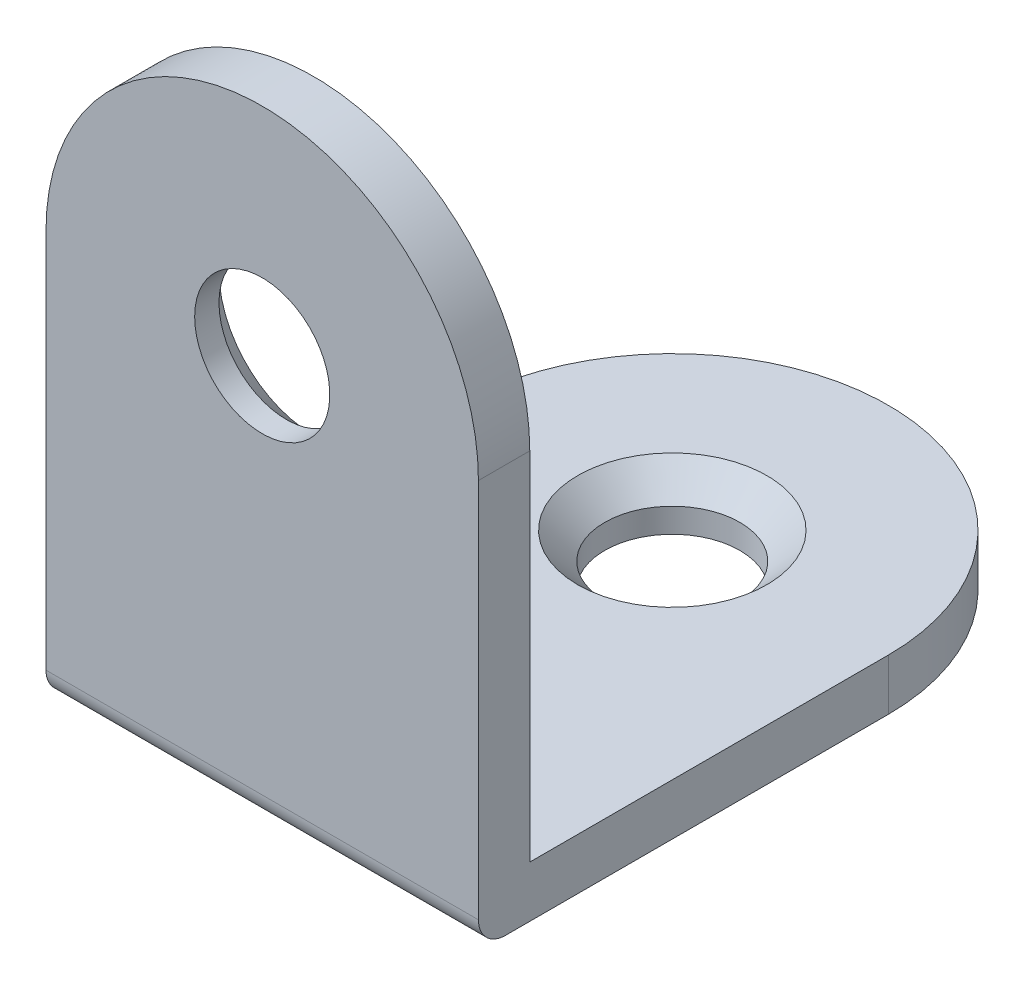
ISO-10303-21;
HEADER;
FILE_DESCRIPTION(('STEP AP214'),'2;1');
FILE_NAME('part.step','',(''),(''),'','','');
FILE_SCHEMA(('AUTOMOTIVE_DESIGN { 1 0 10303 214 1 1 1 1 }'));
ENDSEC;
DATA;
#1=APPLICATION_CONTEXT('core data for automotive mechanical design processes');
#2=APPLICATION_PROTOCOL_DEFINITION('international standard','automotive_design',2000,#1);
#3=PRODUCT_CONTEXT('',#1,'mechanical');
#4=PRODUCT('Part','Part','',(#3));
#5=PRODUCT_RELATED_PRODUCT_CATEGORY('part','',(#4));
#6=PRODUCT_DEFINITION_FORMATION('','',#4);
#7=PRODUCT_DEFINITION_CONTEXT('part definition',#1,'design');
#8=PRODUCT_DEFINITION('design','',#6,#7);
#9=PRODUCT_DEFINITION_SHAPE('','',#8);
#10=(LENGTH_UNIT() NAMED_UNIT(*) SI_UNIT(.MILLI.,.METRE.));
#11=(NAMED_UNIT(*) PLANE_ANGLE_UNIT() SI_UNIT($,.RADIAN.));
#12=(NAMED_UNIT(*) SI_UNIT($,.STERADIAN.) SOLID_ANGLE_UNIT());
#13=UNCERTAINTY_MEASURE_WITH_UNIT(LENGTH_MEASURE(1.E-05),#10,'distance_accuracy_value','');
#14=(GEOMETRIC_REPRESENTATION_CONTEXT(3) GLOBAL_UNCERTAINTY_ASSIGNED_CONTEXT((#13)) GLOBAL_UNIT_ASSIGNED_CONTEXT((#10,
#11,#12)) REPRESENTATION_CONTEXT('',''));
#15=CARTESIAN_POINT('',(0.,0.,0.));
#16=DIRECTION('',(0.,0.,1.));
#17=DIRECTION('',(1.,0.,0.));
#18=AXIS2_PLACEMENT_3D('',#15,#16,#17);
#19=CARTESIAN_POINT('',(16.,0.,1.9));
#20=DIRECTION('',(-1.,0.,0.));
#21=DIRECTION('',(0.,0.,1.));
#22=AXIS2_PLACEMENT_3D('',#19,#20,#21);
#23=PLANE('',#22);
#24=DIRECTION('',(0.,1.,0.));
#25=VECTOR('',#24,1.);
#26=CARTESIAN_POINT('',(16.,0.,1.9));
#27=LINE('',#26,#25);
#28=CARTESIAN_POINT('',(16.,1.,1.9));
#29=VERTEX_POINT('',#28);
#30=CARTESIAN_POINT('',(16.,15.0762690863172,1.9));
#31=VERTEX_POINT('',#30);
#32=EDGE_CURVE('E146',#29,#31,#27,.T.);
#33=ORIENTED_EDGE('',*,*,#32,.F.);
#34=CARTESIAN_POINT('',(16.,1.,0.9));
#35=DIRECTION('',(-1.,0.,0.));
#36=DIRECTION('',(0.,0.,1.));
#37=AXIS2_PLACEMENT_3D('',#34,#35,#36);
#38=CIRCLE('',#37,1.);
#39=CARTESIAN_POINT('',(16.,0.,0.9));
#40=VERTEX_POINT('',#39);
#41=EDGE_CURVE('E72',#29,#40,#38,.F.);
#42=ORIENTED_EDGE('',*,*,#41,.T.);
#43=DIRECTION('',(0.,0.,-1.));
#44=VECTOR('',#43,1.);
#45=CARTESIAN_POINT('',(16.,0.,1.9));
#46=LINE('',#45,#44);
#47=CARTESIAN_POINT('',(16.,0.,-13.2727143322964));
#48=VERTEX_POINT('',#47);
#49=EDGE_CURVE('E130',#40,#48,#46,.T.);
#50=ORIENTED_EDGE('',*,*,#49,.T.);
#51=DIRECTION('',(0.,-1.,0.));
#52=VECTOR('',#51,1.);
#53=CARTESIAN_POINT('',(16.,1.9,-13.2727143322964));
#54=LINE('',#53,#52);
#55=CARTESIAN_POINT('',(16.,1.9,-13.2727143322964));
#56=VERTEX_POINT('',#55);
#57=EDGE_CURVE('E123',#56,#48,#54,.T.);
#58=ORIENTED_EDGE('',*,*,#57,.F.);
#59=DIRECTION('',(0.,0.,-1.));
#60=VECTOR('',#59,1.);
#61=CARTESIAN_POINT('',(16.,1.9,1.9));
#62=LINE('',#61,#60);
#63=CARTESIAN_POINT('',(16.,1.9,0.));
#64=VERTEX_POINT('',#63);
#65=EDGE_CURVE('E107',#64,#56,#62,.T.);
#66=ORIENTED_EDGE('',*,*,#65,.F.);
#67=DIRECTION('',(0.,1.,0.));
#68=VECTOR('',#67,1.);
#69=CARTESIAN_POINT('',(16.,0.,0.));
#70=LINE('',#69,#68);
#71=CARTESIAN_POINT('',(16.,15.0762690863172,0.));
#72=VERTEX_POINT('',#71);
#73=EDGE_CURVE('E133',#64,#72,#70,.T.);
#74=ORIENTED_EDGE('',*,*,#73,.T.);
#75=DIRECTION('',(0.,0.,-1.));
#76=VECTOR('',#75,1.);
#77=CARTESIAN_POINT('',(16.,15.0762690863172,1.9));
#78=LINE('',#77,#76);
#79=EDGE_CURVE('E171',#31,#72,#78,.T.);
#80=ORIENTED_EDGE('',*,*,#79,.F.);
#81=EDGE_LOOP('',(#33,#42,#50,#58,#66,#74,#80));
#82=FACE_BOUND('',#81,.T.);
#83=ADVANCED_FACE('F47',(#82),#23,.F.);
#84=CARTESIAN_POINT('',(8.00000000000001,15.0762690863172,1.9));
#85=DIRECTION('',(0.,0.,-1.));
#86=DIRECTION('',(-1.,0.,0.));
#87=AXIS2_PLACEMENT_3D('',#84,#85,#86);
#88=CYLINDRICAL_SURFACE('',#87,8.);
#89=CARTESIAN_POINT('',(8.00000000000001,15.0762690863172,0.));
#90=DIRECTION('',(0.,0.,1.));
#91=DIRECTION('',(1.,0.,0.));
#92=AXIS2_PLACEMENT_3D('',#89,#90,#91);
#93=CIRCLE('',#92,8.);
#94=CARTESIAN_POINT('',(0.,15.0762690863172,0.));
#95=VERTEX_POINT('',#94);
#96=EDGE_CURVE('E137',#72,#95,#93,.T.);
#97=ORIENTED_EDGE('',*,*,#96,.T.);
#98=DIRECTION('',(0.,0.,-1.));
#99=VECTOR('',#98,1.);
#100=CARTESIAN_POINT('',(0.,15.0762690863172,1.9));
#101=LINE('',#100,#99);
#102=CARTESIAN_POINT('',(0.,15.0762690863172,1.9));
#103=VERTEX_POINT('',#102);
#104=EDGE_CURVE('E167',#103,#95,#101,.T.);
#105=ORIENTED_EDGE('',*,*,#104,.F.);
#106=CARTESIAN_POINT('',(8.00000000000001,15.0762690863172,1.9));
#107=DIRECTION('',(0.,0.,1.));
#108=DIRECTION('',(1.,0.,0.));
#109=AXIS2_PLACEMENT_3D('',#106,#107,#108);
#110=CIRCLE('',#109,8.);
#111=EDGE_CURVE('E150',#31,#103,#110,.T.);
#112=ORIENTED_EDGE('',*,*,#111,.F.);
#113=ORIENTED_EDGE('',*,*,#79,.T.);
#114=EDGE_LOOP('',(#97,#105,#112,#113));
#115=FACE_BOUND('',#114,.T.);
#116=ADVANCED_FACE('F212',(#115),#88,.T.);
#117=CARTESIAN_POINT('',(0.,0.,1.9));
#118=DIRECTION('',(1.,0.,0.));
#119=DIRECTION('',(0.,1.,0.));
#120=AXIS2_PLACEMENT_3D('',#117,#118,#119);
#121=PLANE('',#120);
#122=DIRECTION('',(0.,0.,-1.));
#123=VECTOR('',#122,1.);
#124=CARTESIAN_POINT('',(0.,0.,1.9));
#125=LINE('',#124,#123);
#126=CARTESIAN_POINT('',(0.,0.,0.9));
#127=VERTEX_POINT('',#126);
#128=CARTESIAN_POINT('',(0.,0.,-13.2727143322964));
#129=VERTEX_POINT('',#128);
#130=EDGE_CURVE('E164',#127,#129,#125,.T.);
#131=ORIENTED_EDGE('',*,*,#130,.F.);
#132=CARTESIAN_POINT('',(0.,1.,0.9));
#133=DIRECTION('',(1.,0.,0.));
#134=DIRECTION('',(0.,1.,0.));
#135=AXIS2_PLACEMENT_3D('',#132,#133,#134);
#136=CIRCLE('',#135,1.);
#137=CARTESIAN_POINT('',(0.,1.,1.9));
#138=VERTEX_POINT('',#137);
#139=EDGE_CURVE('E185',#127,#138,#136,.F.);
#140=ORIENTED_EDGE('',*,*,#139,.T.);
#141=DIRECTION('',(0.,-1.,0.));
#142=VECTOR('',#141,1.);
#143=CARTESIAN_POINT('',(0.,0.,1.9));
#144=LINE('',#143,#142);
#145=EDGE_CURVE('E153',#103,#138,#144,.T.);
#146=ORIENTED_EDGE('',*,*,#145,.F.);
#147=ORIENTED_EDGE('',*,*,#104,.T.);
#148=DIRECTION('',(0.,-1.,0.));
#149=VECTOR('',#148,1.);
#150=CARTESIAN_POINT('',(0.,0.,0.));
#151=LINE('',#150,#149);
#152=CARTESIAN_POINT('',(0.,1.9,0.));
#153=VERTEX_POINT('',#152);
#154=EDGE_CURVE('E147',#95,#153,#151,.T.);
#155=ORIENTED_EDGE('',*,*,#154,.T.);
#156=DIRECTION('',(0.,0.,1.));
#157=VECTOR('',#156,1.);
#158=CARTESIAN_POINT('',(0.,1.9,-13.2727143322964));
#159=LINE('',#158,#157);
#160=CARTESIAN_POINT('',(0.,1.9,-13.2727143322964));
#161=VERTEX_POINT('',#160);
#162=EDGE_CURVE('E128',#161,#153,#159,.T.);
#163=ORIENTED_EDGE('',*,*,#162,.F.);
#164=DIRECTION('',(0.,-1.,0.));
#165=VECTOR('',#164,1.);
#166=CARTESIAN_POINT('',(0.,1.9,-13.2727143322964));
#167=LINE('',#166,#165);
#168=EDGE_CURVE('E125',#161,#129,#167,.T.);
#169=ORIENTED_EDGE('',*,*,#168,.T.);
#170=EDGE_LOOP('',(#131,#140,#146,#147,#155,#163,#169));
#171=FACE_BOUND('',#170,.T.);
#172=ADVANCED_FACE('F219',(#171),#121,.F.);
#173=CARTESIAN_POINT('',(8.00000000000001,15.0762690863172,1.9));
#174=DIRECTION('',(0.,0.,-1.));
#175=DIRECTION('',(-1.,0.,0.));
#176=AXIS2_PLACEMENT_3D('',#173,#174,#175);
#177=CYLINDRICAL_SURFACE('',#176,2.5);
#178=CARTESIAN_POINT('',(8.00000000000001,15.0762690863172,0.999999999999994));
#179=DIRECTION('',(0.,0.,1.));
#180=DIRECTION('',(1.,0.,0.));
#181=AXIS2_PLACEMENT_3D('',#178,#179,#180);
#182=CIRCLE('',#181,2.5);
#183=CARTESIAN_POINT('',(5.50000000000001,15.0762690863172,0.999999999999994));
#184=VERTEX_POINT('',#183);
#185=EDGE_CURVE('E11',#184,#184,#182,.F.);
#186=CARTESIAN_POINT('',(8.00000000000001,15.0762690863172,1.9));
#187=DIRECTION('',(0.,0.,1.));
#188=DIRECTION('',(1.,0.,0.));
#189=AXIS2_PLACEMENT_3D('',#186,#187,#188);
#190=CIRCLE('',#189,2.5);
#191=CARTESIAN_POINT('',(5.50000000000001,15.0762690863172,1.9));
#192=VERTEX_POINT('',#191);
#193=EDGE_CURVE('E142',#192,#192,#190,.T.);
#194=CARTESIAN_POINT('',(5.50000000000001,15.0762690863172,0.999999999999994));
#195=CARTESIAN_POINT('',(5.50000000000001,15.0762690863172,1.00937499999999));
#196=CARTESIAN_POINT('',(5.50000000000001,15.0762690863172,1.01874999999999));
#197=CARTESIAN_POINT('',(5.50000000000001,15.0762690863172,1.03749999999999));
#198=CARTESIAN_POINT('',(5.50000000000001,15.0762690863172,1.04687499999999));
#199=CARTESIAN_POINT('',(5.50000000000001,15.0762690863172,1.06562499999999));
#200=CARTESIAN_POINT('',(5.50000000000001,15.0762690863172,1.07499999999999));
#201=CARTESIAN_POINT('',(5.50000000000001,15.0762690863172,1.09374999999999));
#202=CARTESIAN_POINT('',(5.50000000000001,15.0762690863172,1.10312499999999));
#203=CARTESIAN_POINT('',(5.50000000000001,15.0762690863172,1.12187499999999));
#204=CARTESIAN_POINT('',(5.50000000000001,15.0762690863172,1.13124999999999));
#205=CARTESIAN_POINT('',(5.50000000000001,15.0762690863172,1.14999999999999));
#206=CARTESIAN_POINT('',(5.50000000000001,15.0762690863172,1.15937499999999));
#207=CARTESIAN_POINT('',(5.50000000000001,15.0762690863172,1.17812499999999));
#208=CARTESIAN_POINT('',(5.50000000000001,15.0762690863172,1.18749999999999));
#209=CARTESIAN_POINT('',(5.50000000000001,15.0762690863172,1.20625));
#210=CARTESIAN_POINT('',(5.50000000000001,15.0762690863172,1.215625));
#211=CARTESIAN_POINT('',(5.50000000000001,15.0762690863172,1.234375));
#212=CARTESIAN_POINT('',(5.50000000000001,15.0762690863172,1.24375));
#213=CARTESIAN_POINT('',(5.50000000000001,15.0762690863172,1.2625));
#214=CARTESIAN_POINT('',(5.50000000000001,15.0762690863172,1.271875));
#215=CARTESIAN_POINT('',(5.50000000000001,15.0762690863172,1.290625));
#216=CARTESIAN_POINT('',(5.50000000000001,15.0762690863172,1.3));
#217=CARTESIAN_POINT('',(5.50000000000001,15.0762690863172,1.31875));
#218=CARTESIAN_POINT('',(5.50000000000001,15.0762690863172,1.328125));
#219=CARTESIAN_POINT('',(5.50000000000001,15.0762690863172,1.346875));
#220=CARTESIAN_POINT('',(5.50000000000001,15.0762690863172,1.35625));
#221=CARTESIAN_POINT('',(5.50000000000001,15.0762690863172,1.375));
#222=CARTESIAN_POINT('',(5.50000000000001,15.0762690863172,1.384375));
#223=CARTESIAN_POINT('',(5.50000000000001,15.0762690863172,1.403125));
#224=CARTESIAN_POINT('',(5.50000000000001,15.0762690863172,1.4125));
#225=CARTESIAN_POINT('',(5.50000000000001,15.0762690863172,1.43125));
#226=CARTESIAN_POINT('',(5.50000000000001,15.0762690863172,1.440625));
#227=CARTESIAN_POINT('',(5.50000000000001,15.0762690863172,1.459375));
#228=CARTESIAN_POINT('',(5.50000000000001,15.0762690863172,1.46875));
#229=CARTESIAN_POINT('',(5.50000000000001,15.0762690863172,1.4875));
#230=CARTESIAN_POINT('',(5.50000000000001,15.0762690863172,1.496875));
#231=CARTESIAN_POINT('',(5.50000000000001,15.0762690863172,1.515625));
#232=CARTESIAN_POINT('',(5.50000000000001,15.0762690863172,1.525));
#233=CARTESIAN_POINT('',(5.50000000000001,15.0762690863172,1.54375));
#234=CARTESIAN_POINT('',(5.50000000000001,15.0762690863172,1.553125));
#235=CARTESIAN_POINT('',(5.50000000000001,15.0762690863172,1.571875));
#236=CARTESIAN_POINT('',(5.50000000000001,15.0762690863172,1.58125));
#237=CARTESIAN_POINT('',(5.50000000000001,15.0762690863172,1.6));
#238=CARTESIAN_POINT('',(5.50000000000001,15.0762690863172,1.609375));
#239=CARTESIAN_POINT('',(5.50000000000001,15.0762690863172,1.628125));
#240=CARTESIAN_POINT('',(5.50000000000001,15.0762690863172,1.6375));
#241=CARTESIAN_POINT('',(5.50000000000001,15.0762690863172,1.65625));
#242=CARTESIAN_POINT('',(5.50000000000001,15.0762690863172,1.665625));
#243=CARTESIAN_POINT('',(5.50000000000001,15.0762690863172,1.684375));
#244=CARTESIAN_POINT('',(5.50000000000001,15.0762690863172,1.69375));
#245=CARTESIAN_POINT('',(5.50000000000001,15.0762690863172,1.7125));
#246=CARTESIAN_POINT('',(5.50000000000001,15.0762690863172,1.721875));
#247=CARTESIAN_POINT('',(5.50000000000001,15.0762690863172,1.740625));
#248=CARTESIAN_POINT('',(5.50000000000001,15.0762690863172,1.75));
#249=CARTESIAN_POINT('',(5.50000000000001,15.0762690863172,1.76875));
#250=CARTESIAN_POINT('',(5.50000000000001,15.0762690863172,1.778125));
#251=CARTESIAN_POINT('',(5.50000000000001,15.0762690863172,1.796875));
#252=CARTESIAN_POINT('',(5.50000000000001,15.0762690863172,1.80625));
#253=CARTESIAN_POINT('',(5.50000000000001,15.0762690863172,1.825));
#254=CARTESIAN_POINT('',(5.50000000000001,15.0762690863172,1.834375));
#255=CARTESIAN_POINT('',(5.50000000000001,15.0762690863172,1.853125));
#256=CARTESIAN_POINT('',(5.50000000000001,15.0762690863172,1.8625));
#257=CARTESIAN_POINT('',(5.50000000000001,15.0762690863172,1.88125));
#258=CARTESIAN_POINT('',(5.50000000000001,15.0762690863172,1.890625));
#259=CARTESIAN_POINT('',(5.50000000000001,15.0762690863172,1.9));
#260=B_SPLINE_CURVE_WITH_KNOTS('',3,(#194,#195,#196,#197,#198,#199,#200,#201,#202,#203,#204,
#205,#206,#207,#208,#209,#210,#211,#212,#213,#214,#215,#216,#217,#218,#219,#220,#221,#222,#223,
#224,#225,#226,#227,#228,#229,#230,#231,#232,#233,#234,#235,#236,#237,#238,#239,#240,#241,#242,
#243,#244,#245,#246,#247,#248,#249,#250,#251,#252,#253,#254,#255,#256,#257,#258,#259),
.UNSPECIFIED.,.F.,.F.,(4,2,2,2,2,2,2,2,2,2,2,2,2,2,2,2,2,2,2,2,2,2,2,2,2,2,2,2,2,2,2,2,4),(0.,
0.0281250000000004,0.0562500000000005,0.0843750000000007,0.112500000000001,0.140625000000001,
0.168750000000001,0.196875000000002,0.225000000000002,0.253125000000002,0.281250000000002,
0.309375000000002,0.337500000000003,0.365625000000003,0.393750000000003,0.421875000000003,
0.450000000000003,0.478125000000004,0.506250000000004,0.534375000000004,0.562500000000004,
0.590625000000004,0.618750000000004,0.646875000000005,0.675000000000005,0.703125000000005,
0.731250000000005,0.759375000000005,0.787500000000006,0.815625000000006,0.843750000000006,
0.871875000000006,0.900000000000006),.UNSPECIFIED.);
#261=EDGE_CURVE('BSEAM224',#184,#192,#260,.T.);
#262=ORIENTED_EDGE('',*,*,#185,.T.);
#263=ORIENTED_EDGE('',*,*,#193,.T.);
#264=ORIENTED_EDGE('',*,*,#261,.T.);
#265=ORIENTED_EDGE('',*,*,#261,.F.);
#266=EDGE_LOOP('',(#262,#264,#263,#265));
#267=FACE_BOUND('',#266,.T.);
#268=ADVANCED_FACE('F224',(#267),#177,.F.);
#269=CARTESIAN_POINT('',(0.,0.,1.9));
#270=DIRECTION('',(0.,1.,0.));
#271=DIRECTION('',(0.,0.,1.));
#272=AXIS2_PLACEMENT_3D('',#269,#270,#271);
#273=PLANE('',#272);
#274=ORIENTED_EDGE('',*,*,#49,.F.);
#275=DIRECTION('',(1.,0.,0.));
#276=VECTOR('',#275,1.);
#277=CARTESIAN_POINT('',(0.,0.,0.9));
#278=LINE('',#277,#276);
#279=EDGE_CURVE('E64',#40,#127,#278,.F.);
#280=ORIENTED_EDGE('',*,*,#279,.T.);
#281=ORIENTED_EDGE('',*,*,#130,.T.);
#282=CARTESIAN_POINT('',(7.99999999999997,0.,-13.2727143322964));
#283=DIRECTION('',(0.,1.,0.));
#284=DIRECTION('',(0.,0.,1.));
#285=AXIS2_PLACEMENT_3D('',#282,#283,#284);
#286=CIRCLE('',#285,8.00000000000003);
#287=EDGE_CURVE('E117',#48,#129,#286,.T.);
#288=ORIENTED_EDGE('',*,*,#287,.F.);
#289=EDGE_LOOP('',(#274,#280,#281,#288));
#290=FACE_BOUND('',#289,.T.);
#291=CARTESIAN_POINT('',(7.99999999999997,0.,-13.2727143322964));
#292=DIRECTION('',(0.,1.,0.));
#293=DIRECTION('',(0.,0.,1.));
#294=AXIS2_PLACEMENT_3D('',#291,#292,#293);
#295=CIRCLE('',#294,2.5);
#296=CARTESIAN_POINT('',(7.99999999999997,0.,-15.7727143322964));
#297=VERTEX_POINT('',#296);
#298=EDGE_CURVE('E348',#297,#297,#295,.T.);
#299=ORIENTED_EDGE('',*,*,#298,.T.);
#300=EDGE_LOOP('',(#299));
#301=FACE_BOUND('',#300,.T.);
#302=ADVANCED_FACE('F227',(#290,#301),#273,.F.);
#303=CARTESIAN_POINT('',(0.,0.,1.9));
#304=DIRECTION('',(0.,0.,1.));
#305=DIRECTION('',(1.,0.,0.));
#306=AXIS2_PLACEMENT_3D('',#303,#304,#305);
#307=PLANE('',#306);
#308=ORIENTED_EDGE('',*,*,#145,.T.);
#309=DIRECTION('',(1.,0.,0.));
#310=VECTOR('',#309,1.);
#311=CARTESIAN_POINT('',(16.,1.,1.9));
#312=LINE('',#311,#310);
#313=EDGE_CURVE('E177',#138,#29,#312,.T.);
#314=ORIENTED_EDGE('',*,*,#313,.T.);
#315=ORIENTED_EDGE('',*,*,#32,.T.);
#316=ORIENTED_EDGE('',*,*,#111,.T.);
#317=EDGE_LOOP('',(#308,#314,#315,#316));
#318=FACE_BOUND('',#317,.T.);
#319=ORIENTED_EDGE('',*,*,#193,.F.);
#320=EDGE_LOOP('',(#319));
#321=FACE_BOUND('',#320,.T.);
#322=ADVANCED_FACE('F248',(#318,#321),#307,.T.);
#323=CARTESIAN_POINT('',(0.,0.,0.));
#324=DIRECTION('',(0.,0.,1.));
#325=DIRECTION('',(1.,0.,0.));
#326=AXIS2_PLACEMENT_3D('',#323,#324,#325);
#327=PLANE('',#326);
#328=CARTESIAN_POINT('',(8.00000000000001,15.0762690863172,0.));
#329=DIRECTION('',(0.,0.,1.));
#330=DIRECTION('',(1.,0.,0.));
#331=AXIS2_PLACEMENT_3D('',#328,#329,#330);
#332=CIRCLE('',#331,3.49999999999999);
#333=CARTESIAN_POINT('',(11.5,15.0762690863172,0.));
#334=VERTEX_POINT('',#333);
#335=EDGE_CURVE('E57',#334,#334,#332,.T.);
#336=ORIENTED_EDGE('',*,*,#335,.T.);
#337=EDGE_LOOP('',(#336));
#338=FACE_BOUND('',#337,.T.);
#339=ORIENTED_EDGE('',*,*,#73,.F.);
#340=DIRECTION('',(-1.,0.,0.));
#341=VECTOR('',#340,1.);
#342=CARTESIAN_POINT('',(0.,1.9,0.));
#343=LINE('',#342,#341);
#344=EDGE_CURVE('E113',#64,#153,#343,.T.);
#345=ORIENTED_EDGE('',*,*,#344,.T.);
#346=ORIENTED_EDGE('',*,*,#154,.F.);
#347=ORIENTED_EDGE('',*,*,#96,.F.);
#348=EDGE_LOOP('',(#339,#345,#346,#347));
#349=FACE_BOUND('',#348,.T.);
#350=ADVANCED_FACE('F199',(#338,#349),#327,.F.);
#351=CARTESIAN_POINT('',(7.99999999999997,1.9,-13.2727143322964));
#352=DIRECTION('',(0.,1.,0.));
#353=DIRECTION('',(0.,0.,1.));
#354=AXIS2_PLACEMENT_3D('',#351,#352,#353);
#355=PLANE('',#354);
#356=CARTESIAN_POINT('',(7.99999999999997,1.9,-13.2727143322964));
#357=DIRECTION('',(0.,1.,0.));
#358=DIRECTION('',(0.,0.,1.));
#359=AXIS2_PLACEMENT_3D('',#356,#357,#358);
#360=CIRCLE('',#359,3.50000000000002);
#361=CARTESIAN_POINT('',(7.99999999999997,1.9,-9.77271433229639));
#362=VERTEX_POINT('',#361);
#363=EDGE_CURVE('E192',#362,#362,#360,.F.);
#364=ORIENTED_EDGE('',*,*,#363,.T.);
#365=EDGE_LOOP('',(#364));
#366=FACE_BOUND('',#365,.T.);
#367=ORIENTED_EDGE('',*,*,#344,.F.);
#368=ORIENTED_EDGE('',*,*,#65,.T.);
#369=CARTESIAN_POINT('',(7.99999999999997,1.9,-13.2727143322964));
#370=DIRECTION('',(0.,1.,0.));
#371=DIRECTION('',(0.,0.,1.));
#372=AXIS2_PLACEMENT_3D('',#369,#370,#371);
#373=CIRCLE('',#372,8.00000000000003);
#374=EDGE_CURVE('E110',#56,#161,#373,.T.);
#375=ORIENTED_EDGE('',*,*,#374,.T.);
#376=ORIENTED_EDGE('',*,*,#162,.T.);
#377=EDGE_LOOP('',(#367,#368,#375,#376));
#378=FACE_BOUND('',#377,.T.);
#379=ADVANCED_FACE('F109',(#366,#378),#355,.T.);
#380=CARTESIAN_POINT('',(7.99999999999997,1.9,-13.2727143322964));
#381=DIRECTION('',(0.,-1.,0.));
#382=DIRECTION('',(0.,0.,-1.));
#383=AXIS2_PLACEMENT_3D('',#380,#381,#382);
#384=CYLINDRICAL_SURFACE('',#383,8.00000000000003);
#385=ORIENTED_EDGE('',*,*,#287,.T.);
#386=ORIENTED_EDGE('',*,*,#168,.F.);
#387=ORIENTED_EDGE('',*,*,#374,.F.);
#388=ORIENTED_EDGE('',*,*,#57,.T.);
#389=EDGE_LOOP('',(#385,#386,#387,#388));
#390=FACE_BOUND('',#389,.T.);
#391=ADVANCED_FACE('F122',(#390),#384,.T.);
#392=CARTESIAN_POINT('',(7.99999999999997,1.9,-13.2727143322964));
#393=DIRECTION('',(0.,-1.,0.));
#394=DIRECTION('',(0.,0.,-1.));
#395=AXIS2_PLACEMENT_3D('',#392,#393,#394);
#396=CYLINDRICAL_SURFACE('',#395,2.5);
#397=CARTESIAN_POINT('',(7.99999999999997,0.899999999999986,-13.2727143322964));
#398=DIRECTION('',(0.,1.,0.));
#399=DIRECTION('',(0.,0.,1.));
#400=AXIS2_PLACEMENT_3D('',#397,#398,#399);
#401=CIRCLE('',#400,2.5);
#402=CARTESIAN_POINT('',(7.99999999999997,0.899999999999985,-15.7727143322964));
#403=VERTEX_POINT('',#402);
#404=EDGE_CURVE('E188',#403,#403,#401,.T.);
#405=CARTESIAN_POINT('',(7.99999999999997,0.899999999999985,-15.7727143322964));
#406=CARTESIAN_POINT('',(7.99999999999997,0.890624999999986,-15.7727143322964));
#407=CARTESIAN_POINT('',(7.99999999999997,0.881249999999986,-15.7727143322964));
#408=CARTESIAN_POINT('',(7.99999999999997,0.862499999999986,-15.7727143322964));
#409=CARTESIAN_POINT('',(7.99999999999997,0.853124999999986,-15.7727143322964));
#410=CARTESIAN_POINT('',(7.99999999999997,0.834374999999987,-15.7727143322964));
#411=CARTESIAN_POINT('',(7.99999999999997,0.824999999999987,-15.7727143322964));
#412=CARTESIAN_POINT('',(7.99999999999997,0.806249999999987,-15.7727143322964));
#413=CARTESIAN_POINT('',(7.99999999999997,0.796874999999987,-15.7727143322964));
#414=CARTESIAN_POINT('',(7.99999999999997,0.778124999999987,-15.7727143322964));
#415=CARTESIAN_POINT('',(7.99999999999997,0.768749999999987,-15.7727143322964));
#416=CARTESIAN_POINT('',(7.99999999999997,0.749999999999988,-15.7727143322964));
#417=CARTESIAN_POINT('',(7.99999999999997,0.740624999999988,-15.7727143322964));
#418=CARTESIAN_POINT('',(7.99999999999997,0.721874999999988,-15.7727143322964));
#419=CARTESIAN_POINT('',(7.99999999999997,0.712499999999989,-15.7727143322964));
#420=CARTESIAN_POINT('',(7.99999999999997,0.693749999999989,-15.7727143322964));
#421=CARTESIAN_POINT('',(7.99999999999997,0.684374999999989,-15.7727143322964));
#422=CARTESIAN_POINT('',(7.99999999999997,0.665624999999989,-15.7727143322964));
#423=CARTESIAN_POINT('',(7.99999999999997,0.656249999999989,-15.7727143322964));
#424=CARTESIAN_POINT('',(7.99999999999997,0.63749999999999,-15.7727143322964));
#425=CARTESIAN_POINT('',(7.99999999999997,0.62812499999999,-15.7727143322964));
#426=CARTESIAN_POINT('',(7.99999999999997,0.60937499999999,-15.7727143322964));
#427=CARTESIAN_POINT('',(7.99999999999997,0.59999999999999,-15.7727143322964));
#428=CARTESIAN_POINT('',(7.99999999999997,0.581249999999991,-15.7727143322964));
#429=CARTESIAN_POINT('',(7.99999999999997,0.571874999999991,-15.7727143322964));
#430=CARTESIAN_POINT('',(7.99999999999997,0.553124999999991,-15.7727143322964));
#431=CARTESIAN_POINT('',(7.99999999999997,0.543749999999991,-15.7727143322964));
#432=CARTESIAN_POINT('',(7.99999999999997,0.524999999999992,-15.7727143322964));
#433=CARTESIAN_POINT('',(7.99999999999997,0.515624999999992,-15.7727143322964));
#434=CARTESIAN_POINT('',(7.99999999999997,0.496874999999992,-15.7727143322964));
#435=CARTESIAN_POINT('',(7.99999999999997,0.487499999999992,-15.7727143322964));
#436=CARTESIAN_POINT('',(7.99999999999997,0.468749999999992,-15.7727143322964));
#437=CARTESIAN_POINT('',(7.99999999999997,0.459374999999993,-15.7727143322964));
#438=CARTESIAN_POINT('',(7.99999999999997,0.440624999999993,-15.7727143322964));
#439=CARTESIAN_POINT('',(7.99999999999997,0.431249999999993,-15.7727143322964));
#440=CARTESIAN_POINT('',(7.99999999999997,0.412499999999993,-15.7727143322964));
#441=CARTESIAN_POINT('',(7.99999999999997,0.403124999999993,-15.7727143322964));
#442=CARTESIAN_POINT('',(7.99999999999997,0.384374999999994,-15.7727143322964));
#443=CARTESIAN_POINT('',(7.99999999999997,0.374999999999994,-15.7727143322964));
#444=CARTESIAN_POINT('',(7.99999999999997,0.356249999999994,-15.7727143322964));
#445=CARTESIAN_POINT('',(7.99999999999997,0.346874999999994,-15.7727143322964));
#446=CARTESIAN_POINT('',(7.99999999999997,0.328124999999995,-15.7727143322964));
#447=CARTESIAN_POINT('',(7.99999999999997,0.318749999999995,-15.7727143322964));
#448=CARTESIAN_POINT('',(7.99999999999997,0.299999999999995,-15.7727143322964));
#449=CARTESIAN_POINT('',(7.99999999999997,0.290624999999995,-15.7727143322964));
#450=CARTESIAN_POINT('',(7.99999999999997,0.271874999999996,-15.7727143322964));
#451=CARTESIAN_POINT('',(7.99999999999997,0.262499999999996,-15.7727143322964));
#452=CARTESIAN_POINT('',(7.99999999999997,0.243749999999996,-15.7727143322964));
#453=CARTESIAN_POINT('',(7.99999999999997,0.234374999999996,-15.7727143322964));
#454=CARTESIAN_POINT('',(7.99999999999997,0.215624999999997,-15.7727143322964));
#455=CARTESIAN_POINT('',(7.99999999999997,0.206249999999997,-15.7727143322964));
#456=CARTESIAN_POINT('',(7.99999999999997,0.187499999999997,-15.7727143322964));
#457=CARTESIAN_POINT('',(7.99999999999997,0.178124999999997,-15.7727143322964));
#458=CARTESIAN_POINT('',(7.99999999999997,0.159374999999997,-15.7727143322964));
#459=CARTESIAN_POINT('',(7.99999999999997,0.149999999999998,-15.7727143322964));
#460=CARTESIAN_POINT('',(7.99999999999997,0.131249999999998,-15.7727143322964));
#461=CARTESIAN_POINT('',(7.99999999999997,0.121874999999998,-15.7727143322964));
#462=CARTESIAN_POINT('',(7.99999999999997,0.103124999999998,-15.7727143322964));
#463=CARTESIAN_POINT('',(7.99999999999997,0.0937499999999984,-15.7727143322964));
#464=CARTESIAN_POINT('',(7.99999999999997,0.0749999999999987,-15.7727143322964));
#465=CARTESIAN_POINT('',(7.99999999999997,0.0656249999999989,-15.7727143322964));
#466=CARTESIAN_POINT('',(7.99999999999997,0.0468749999999992,-15.7727143322964));
#467=CARTESIAN_POINT('',(7.99999999999997,0.0374999999999993,-15.7727143322964));
#468=CARTESIAN_POINT('',(7.99999999999997,0.0187499999999997,-15.7727143322964));
#469=CARTESIAN_POINT('',(7.99999999999997,0.00937499999999982,-15.7727143322964));
#470=CARTESIAN_POINT('',(7.99999999999997,0.,-15.7727143322964));
#471=B_SPLINE_CURVE_WITH_KNOTS('',3,(#405,#406,#407,#408,#409,#410,#411,#412,#413,#414,#415,
#416,#417,#418,#419,#420,#421,#422,#423,#424,#425,#426,#427,#428,#429,#430,#431,#432,#433,#434,
#435,#436,#437,#438,#439,#440,#441,#442,#443,#444,#445,#446,#447,#448,#449,#450,#451,#452,#453,
#454,#455,#456,#457,#458,#459,#460,#461,#462,#463,#464,#465,#466,#467,#468,#469,#470),
.UNSPECIFIED.,.F.,.F.,(4,2,2,2,2,2,2,2,2,2,2,2,2,2,2,2,2,2,2,2,2,2,2,2,2,2,2,2,2,2,2,2,4),(0.,
0.0281249999999995,0.056249999999999,0.0843749999999987,0.112499999999998,0.140624999999998,
0.168749999999997,0.196874999999997,0.224999999999996,0.253124999999996,0.281249999999996,
0.309374999999995,0.337499999999994,0.365624999999994,0.393749999999993,0.421874999999993,
0.449999999999993,0.478124999999992,0.506249999999992,0.534374999999991,0.562499999999991,
0.59062499999999,0.61874999999999,0.646874999999989,0.674999999999989,0.703124999999988,
0.731249999999988,0.759374999999988,0.787499999999987,0.815624999999987,0.843749999999986,
0.871874999999986,0.899999999999985),.UNSPECIFIED.);
#472=EDGE_CURVE('BSEAM230',#403,#297,#471,.T.);
#473=ORIENTED_EDGE('',*,*,#404,.T.);
#474=ORIENTED_EDGE('',*,*,#298,.F.);
#475=ORIENTED_EDGE('',*,*,#472,.T.);
#476=ORIENTED_EDGE('',*,*,#472,.F.);
#477=EDGE_LOOP('',(#473,#475,#474,#476));
#478=FACE_BOUND('',#477,.T.);
#479=ADVANCED_FACE('F230',(#478),#396,.F.);
#480=CARTESIAN_POINT('',(0.,1.,0.9));
#481=DIRECTION('',(-1.,0.,0.));
#482=DIRECTION('',(0.,0.,1.));
#483=AXIS2_PLACEMENT_3D('',#480,#481,#482);
#484=CYLINDRICAL_SURFACE('',#483,1.);
#485=ORIENTED_EDGE('',*,*,#139,.F.);
#486=ORIENTED_EDGE('',*,*,#279,.F.);
#487=ORIENTED_EDGE('',*,*,#41,.F.);
#488=ORIENTED_EDGE('',*,*,#313,.F.);
#489=EDGE_LOOP('',(#485,#486,#487,#488));
#490=FACE_BOUND('',#489,.T.);
#491=ADVANCED_FACE('F208',(#490),#484,.T.);
#492=CARTESIAN_POINT('',(7.99999999999997,0.899999999999986,-13.2727143322964));
#493=DIRECTION('',(0.,1.,0.));
#494=DIRECTION('',(0.,0.,1.));
#495=AXIS2_PLACEMENT_3D('',#492,#493,#494);
#496=CONICAL_SURFACE('',#495,2.5,0.785398163397449);
#497=ORIENTED_EDGE('',*,*,#363,.F.);
#498=EDGE_LOOP('',(#497));
#499=FACE_BOUND('',#498,.T.);
#500=ORIENTED_EDGE('',*,*,#404,.F.);
#501=EDGE_LOOP('',(#500));
#502=FACE_BOUND('',#501,.T.);
#503=ADVANCED_FACE('F203',(#499,#502),#496,.F.);
#504=CARTESIAN_POINT('',(8.00000000000001,15.0762690863172,0.));
#505=DIRECTION('',(0.,0.,-1.));
#506=DIRECTION('',(-1.,0.,0.));
#507=AXIS2_PLACEMENT_3D('',#504,#505,#506);
#508=CONICAL_SURFACE('',#507,3.49999999999999,0.785398163397448);
#509=ORIENTED_EDGE('',*,*,#185,.F.);
#510=EDGE_LOOP('',(#509));
#511=FACE_BOUND('',#510,.T.);
#512=ORIENTED_EDGE('',*,*,#335,.F.);
#513=EDGE_LOOP('',(#512));
#514=FACE_BOUND('',#513,.T.);
#515=ADVANCED_FACE('F50',(#511,#514),#508,.F.);
#516=CLOSED_SHELL('',(#83,#116,#172,#268,#302,#322,#350,#379,#391,#479,#491,#503,#515));
#517=MANIFOLD_SOLID_BREP('B2',#516);
#518=ADVANCED_BREP_SHAPE_REPRESENTATION('',(#18,#517),#14);
#519=SHAPE_DEFINITION_REPRESENTATION(#9,#518);
ENDSEC;
END-ISO-10303-21;
